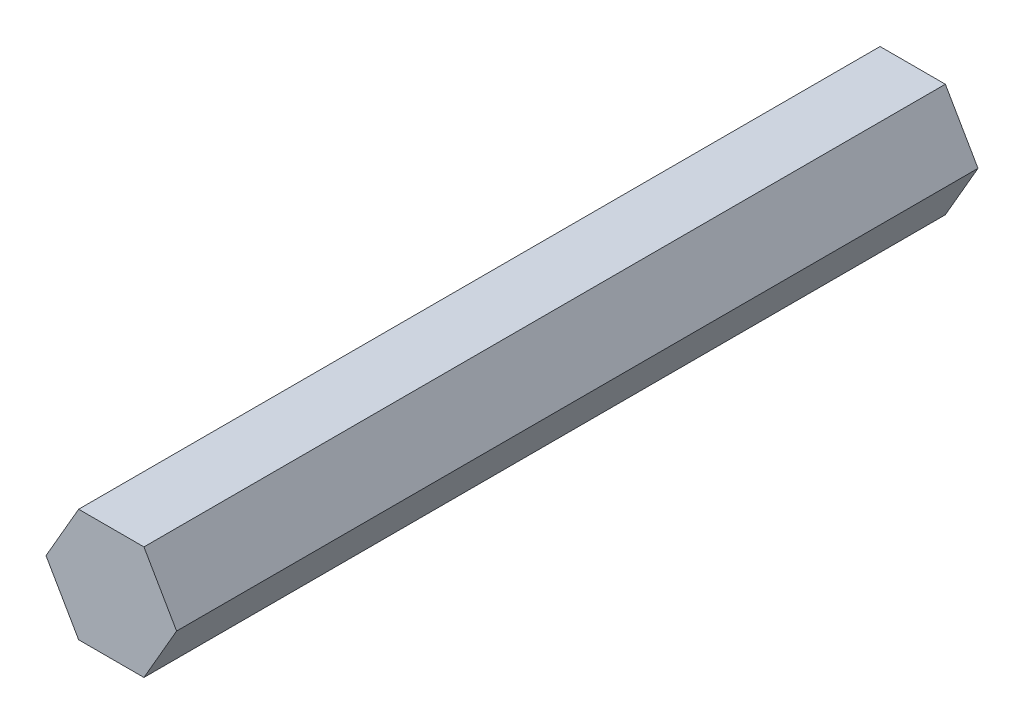
ISO-10303-21;
HEADER;
FILE_DESCRIPTION(('STEP AP214'),'2;1');
FILE_NAME('part.step','',(''),(''),'','','');
FILE_SCHEMA(('AUTOMOTIVE_DESIGN { 1 0 10303 214 1 1 1 1 }'));
ENDSEC;
DATA;
#1=APPLICATION_CONTEXT('core data for automotive mechanical design processes');
#2=APPLICATION_PROTOCOL_DEFINITION('international standard','automotive_design',2000,#1);
#3=PRODUCT_CONTEXT('',#1,'mechanical');
#4=PRODUCT('Part','Part','',(#3));
#5=PRODUCT_RELATED_PRODUCT_CATEGORY('part','',(#4));
#6=PRODUCT_DEFINITION_FORMATION('','',#4);
#7=PRODUCT_DEFINITION_CONTEXT('part definition',#1,'design');
#8=PRODUCT_DEFINITION('design','',#6,#7);
#9=PRODUCT_DEFINITION_SHAPE('','',#8);
#10=(LENGTH_UNIT() NAMED_UNIT(*) SI_UNIT(.MILLI.,.METRE.));
#11=(NAMED_UNIT(*) PLANE_ANGLE_UNIT() SI_UNIT($,.RADIAN.));
#12=(NAMED_UNIT(*) SI_UNIT($,.STERADIAN.) SOLID_ANGLE_UNIT());
#13=UNCERTAINTY_MEASURE_WITH_UNIT(LENGTH_MEASURE(1.E-05),#10,'distance_accuracy_value','');
#14=(GEOMETRIC_REPRESENTATION_CONTEXT(3) GLOBAL_UNCERTAINTY_ASSIGNED_CONTEXT((#13)) GLOBAL_UNIT_ASSIGNED_CONTEXT((#10,
#11,#12)) REPRESENTATION_CONTEXT('',''));
#15=CARTESIAN_POINT('',(0.,0.,0.));
#16=DIRECTION('',(0.,0.,1.));
#17=DIRECTION('',(1.,0.,0.));
#18=AXIS2_PLACEMENT_3D('',#15,#16,#17);
#19=CARTESIAN_POINT('',(3.66617420935412,-6.35000000000001,90.));
#20=DIRECTION('',(-0.866025403784439,0.499999999999999,0.));
#21=DIRECTION('',(-0.499999999999999,-0.866025403784439,0.));
#22=AXIS2_PLACEMENT_3D('',#19,#20,#21);
#23=PLANE('',#22);
#24=DIRECTION('',(0.499999999999999,0.866025403784439,0.));
#25=VECTOR('',#24,1.);
#26=CARTESIAN_POINT('',(3.66617420935412,-6.35000000000001,0.));
#27=LINE('',#26,#25);
#28=CARTESIAN_POINT('',(3.66617420935412,-6.35000000000001,0.));
#29=VERTEX_POINT('',#28);
#30=CARTESIAN_POINT('',(7.33234841870825,0.,0.));
#31=VERTEX_POINT('',#30);
#32=EDGE_CURVE('E116',#29,#31,#27,.T.);
#33=ORIENTED_EDGE('',*,*,#32,.T.);
#34=DIRECTION('',(0.,0.,-1.));
#35=VECTOR('',#34,1.);
#36=CARTESIAN_POINT('',(7.33234841870825,0.,90.));
#37=LINE('',#36,#35);
#38=CARTESIAN_POINT('',(7.33234841870825,0.,90.));
#39=VERTEX_POINT('',#38);
#40=EDGE_CURVE('E11',#39,#31,#37,.T.);
#41=ORIENTED_EDGE('',*,*,#40,.F.);
#42=DIRECTION('',(0.499999999999999,0.866025403784439,0.));
#43=VECTOR('',#42,1.);
#44=CARTESIAN_POINT('',(3.66617420935412,-6.35000000000001,90.));
#45=LINE('',#44,#43);
#46=CARTESIAN_POINT('',(3.66617420935412,-6.35000000000001,90.));
#47=VERTEX_POINT('',#46);
#48=EDGE_CURVE('E126',#47,#39,#45,.T.);
#49=ORIENTED_EDGE('',*,*,#48,.F.);
#50=DIRECTION('',(0.,0.,-1.));
#51=VECTOR('',#50,1.);
#52=CARTESIAN_POINT('',(3.66617420935412,-6.35000000000001,90.));
#53=LINE('',#52,#51);
#54=EDGE_CURVE('E112',#47,#29,#53,.T.);
#55=ORIENTED_EDGE('',*,*,#54,.T.);
#56=EDGE_LOOP('',(#33,#41,#49,#55));
#57=FACE_BOUND('',#56,.T.);
#58=ADVANCED_FACE('F32',(#57),#23,.F.);
#59=CARTESIAN_POINT('',(7.33234841870825,0.,90.));
#60=DIRECTION('',(-0.866025403784439,-0.5,0.));
#61=DIRECTION('',(0.5,-0.866025403784439,0.));
#62=AXIS2_PLACEMENT_3D('',#59,#60,#61);
#63=PLANE('',#62);
#64=DIRECTION('',(-0.5,0.866025403784439,0.));
#65=VECTOR('',#64,1.);
#66=CARTESIAN_POINT('',(7.33234841870825,0.,0.));
#67=LINE('',#66,#65);
#68=CARTESIAN_POINT('',(3.66617420935412,6.35000000000001,0.));
#69=VERTEX_POINT('',#68);
#70=EDGE_CURVE('E119',#31,#69,#67,.T.);
#71=ORIENTED_EDGE('',*,*,#70,.T.);
#72=DIRECTION('',(0.,0.,-1.));
#73=VECTOR('',#72,1.);
#74=CARTESIAN_POINT('',(3.66617420935412,6.35000000000001,90.));
#75=LINE('',#74,#73);
#76=CARTESIAN_POINT('',(3.66617420935412,6.35000000000001,90.));
#77=VERTEX_POINT('',#76);
#78=EDGE_CURVE('E40',#77,#69,#75,.T.);
#79=ORIENTED_EDGE('',*,*,#78,.F.);
#80=DIRECTION('',(-0.5,0.866025403784439,0.));
#81=VECTOR('',#80,1.);
#82=CARTESIAN_POINT('',(7.33234841870825,0.,90.));
#83=LINE('',#82,#81);
#84=EDGE_CURVE('E85',#39,#77,#83,.T.);
#85=ORIENTED_EDGE('',*,*,#84,.F.);
#86=ORIENTED_EDGE('',*,*,#40,.T.);
#87=EDGE_LOOP('',(#71,#79,#85,#86));
#88=FACE_BOUND('',#87,.T.);
#89=ADVANCED_FACE('F150',(#88),#63,.F.);
#90=CARTESIAN_POINT('',(3.66617420935412,6.35000000000001,90.));
#91=DIRECTION('',(0.,-1.,0.));
#92=DIRECTION('',(0.,0.,-1.));
#93=AXIS2_PLACEMENT_3D('',#90,#91,#92);
#94=PLANE('',#93);
#95=DIRECTION('',(-1.,0.,0.));
#96=VECTOR('',#95,1.);
#97=CARTESIAN_POINT('',(3.66617420935412,6.35000000000001,0.));
#98=LINE('',#97,#96);
#99=CARTESIAN_POINT('',(-3.66617420935413,6.35000000000001,0.));
#100=VERTEX_POINT('',#99);
#101=EDGE_CURVE('E121',#69,#100,#98,.T.);
#102=ORIENTED_EDGE('',*,*,#101,.T.);
#103=DIRECTION('',(0.,0.,-1.));
#104=VECTOR('',#103,1.);
#105=CARTESIAN_POINT('',(-3.66617420935413,6.35000000000001,90.));
#106=LINE('',#105,#104);
#107=CARTESIAN_POINT('',(-3.66617420935413,6.35000000000001,90.));
#108=VERTEX_POINT('',#107);
#109=EDGE_CURVE('E107',#108,#100,#106,.T.);
#110=ORIENTED_EDGE('',*,*,#109,.F.);
#111=DIRECTION('',(-1.,0.,0.));
#112=VECTOR('',#111,1.);
#113=CARTESIAN_POINT('',(3.66617420935412,6.35000000000001,90.));
#114=LINE('',#113,#112);
#115=EDGE_CURVE('E98',#77,#108,#114,.T.);
#116=ORIENTED_EDGE('',*,*,#115,.F.);
#117=ORIENTED_EDGE('',*,*,#78,.T.);
#118=EDGE_LOOP('',(#102,#110,#116,#117));
#119=FACE_BOUND('',#118,.T.);
#120=ADVANCED_FACE('F132',(#119),#94,.F.);
#121=CARTESIAN_POINT('',(-3.66617420935413,6.35000000000001,90.));
#122=DIRECTION('',(0.866025403784439,-0.5,0.));
#123=DIRECTION('',(0.5,0.866025403784439,0.));
#124=AXIS2_PLACEMENT_3D('',#121,#122,#123);
#125=PLANE('',#124);
#126=DIRECTION('',(-0.5,-0.866025403784439,0.));
#127=VECTOR('',#126,1.);
#128=CARTESIAN_POINT('',(-3.66617420935413,6.35000000000001,0.));
#129=LINE('',#128,#127);
#130=CARTESIAN_POINT('',(-7.33234841870826,0.,0.));
#131=VERTEX_POINT('',#130);
#132=EDGE_CURVE('E106',#100,#131,#129,.T.);
#133=ORIENTED_EDGE('',*,*,#132,.T.);
#134=DIRECTION('',(0.,0.,-1.));
#135=VECTOR('',#134,1.);
#136=CARTESIAN_POINT('',(-7.33234841870826,0.,90.));
#137=LINE('',#136,#135);
#138=CARTESIAN_POINT('',(-7.33234841870826,0.,90.));
#139=VERTEX_POINT('',#138);
#140=EDGE_CURVE('E103',#139,#131,#137,.T.);
#141=ORIENTED_EDGE('',*,*,#140,.F.);
#142=DIRECTION('',(-0.5,-0.866025403784439,0.));
#143=VECTOR('',#142,1.);
#144=CARTESIAN_POINT('',(-3.66617420935413,6.35000000000001,90.));
#145=LINE('',#144,#143);
#146=EDGE_CURVE('E92',#108,#139,#145,.T.);
#147=ORIENTED_EDGE('',*,*,#146,.F.);
#148=ORIENTED_EDGE('',*,*,#109,.T.);
#149=EDGE_LOOP('',(#133,#141,#147,#148));
#150=FACE_BOUND('',#149,.T.);
#151=ADVANCED_FACE('F104',(#150),#125,.F.);
#152=CARTESIAN_POINT('',(-7.33234841870826,0.,90.));
#153=DIRECTION('',(0.866025403784439,0.5,0.));
#154=DIRECTION('',(-0.5,0.866025403784439,0.));
#155=AXIS2_PLACEMENT_3D('',#152,#153,#154);
#156=PLANE('',#155);
#157=DIRECTION('',(0.5,-0.866025403784439,0.));
#158=VECTOR('',#157,1.);
#159=CARTESIAN_POINT('',(-7.33234841870826,0.,0.));
#160=LINE('',#159,#158);
#161=CARTESIAN_POINT('',(-3.66617420935413,-6.35000000000001,0.));
#162=VERTEX_POINT('',#161);
#163=EDGE_CURVE('E71',#131,#162,#160,.T.);
#164=ORIENTED_EDGE('',*,*,#163,.T.);
#165=DIRECTION('',(0.,0.,-1.));
#166=VECTOR('',#165,1.);
#167=CARTESIAN_POINT('',(-3.66617420935413,-6.35000000000001,90.));
#168=LINE('',#167,#166);
#169=CARTESIAN_POINT('',(-3.66617420935413,-6.35000000000001,90.));
#170=VERTEX_POINT('',#169);
#171=EDGE_CURVE('E108',#170,#162,#168,.T.);
#172=ORIENTED_EDGE('',*,*,#171,.F.);
#173=DIRECTION('',(0.5,-0.866025403784439,0.));
#174=VECTOR('',#173,1.);
#175=CARTESIAN_POINT('',(-7.33234841870826,0.,90.));
#176=LINE('',#175,#174);
#177=EDGE_CURVE('E96',#139,#170,#176,.T.);
#178=ORIENTED_EDGE('',*,*,#177,.F.);
#179=ORIENTED_EDGE('',*,*,#140,.T.);
#180=EDGE_LOOP('',(#164,#172,#178,#179));
#181=FACE_BOUND('',#180,.T.);
#182=ADVANCED_FACE('F110',(#181),#156,.F.);
#183=CARTESIAN_POINT('',(-3.66617420935413,-6.35000000000001,90.));
#184=DIRECTION('',(0.,1.,0.));
#185=DIRECTION('',(-1.,0.,0.));
#186=AXIS2_PLACEMENT_3D('',#183,#184,#185);
#187=PLANE('',#186);
#188=DIRECTION('',(1.,0.,0.));
#189=VECTOR('',#188,1.);
#190=CARTESIAN_POINT('',(-3.66617420935413,-6.35000000000001,0.));
#191=LINE('',#190,#189);
#192=EDGE_CURVE('E77',#162,#29,#191,.T.);
#193=ORIENTED_EDGE('',*,*,#192,.T.);
#194=ORIENTED_EDGE('',*,*,#54,.F.);
#195=DIRECTION('',(1.,0.,0.));
#196=VECTOR('',#195,1.);
#197=CARTESIAN_POINT('',(-3.66617420935413,-6.35000000000001,90.));
#198=LINE('',#197,#196);
#199=EDGE_CURVE('E48',#170,#47,#198,.T.);
#200=ORIENTED_EDGE('',*,*,#199,.F.);
#201=ORIENTED_EDGE('',*,*,#171,.T.);
#202=EDGE_LOOP('',(#193,#194,#200,#201));
#203=FACE_BOUND('',#202,.T.);
#204=ADVANCED_FACE('F139',(#203),#187,.F.);
#205=CARTESIAN_POINT('',(0.,0.,90.));
#206=DIRECTION('',(0.,0.,1.));
#207=DIRECTION('',(1.,0.,0.));
#208=AXIS2_PLACEMENT_3D('',#205,#206,#207);
#209=PLANE('',#208);
#210=ORIENTED_EDGE('',*,*,#48,.T.);
#211=ORIENTED_EDGE('',*,*,#84,.T.);
#212=ORIENTED_EDGE('',*,*,#115,.T.);
#213=ORIENTED_EDGE('',*,*,#146,.T.);
#214=ORIENTED_EDGE('',*,*,#177,.T.);
#215=ORIENTED_EDGE('',*,*,#199,.T.);
#216=EDGE_LOOP('',(#210,#211,#212,#213,#214,#215));
#217=FACE_BOUND('',#216,.T.);
#218=ADVANCED_FACE('F94',(#217),#209,.T.);
#219=CARTESIAN_POINT('',(0.,0.,0.));
#220=DIRECTION('',(0.,0.,1.));
#221=DIRECTION('',(1.,0.,0.));
#222=AXIS2_PLACEMENT_3D('',#219,#220,#221);
#223=PLANE('',#222);
#224=ORIENTED_EDGE('',*,*,#32,.F.);
#225=ORIENTED_EDGE('',*,*,#192,.F.);
#226=ORIENTED_EDGE('',*,*,#163,.F.);
#227=ORIENTED_EDGE('',*,*,#132,.F.);
#228=ORIENTED_EDGE('',*,*,#101,.F.);
#229=ORIENTED_EDGE('',*,*,#70,.F.);
#230=EDGE_LOOP('',(#224,#225,#226,#227,#228,#229));
#231=FACE_BOUND('',#230,.T.);
#232=ADVANCED_FACE('F135',(#231),#223,.F.);
#233=CLOSED_SHELL('',(#58,#89,#120,#151,#182,#204,#218,#232));
#234=MANIFOLD_SOLID_BREP('B2',#233);
#235=ADVANCED_BREP_SHAPE_REPRESENTATION('',(#18,#234),#14);
#236=SHAPE_DEFINITION_REPRESENTATION(#9,#235);
ENDSEC;
END-ISO-10303-21;
